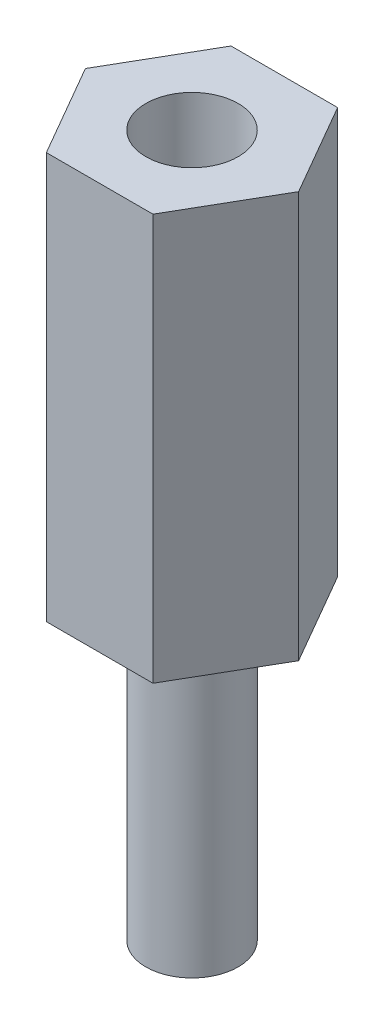
ISO-10303-21;
HEADER;
FILE_DESCRIPTION(('STEP AP214'),'2;1');
FILE_NAME('part.step','',(''),(''),'','','');
FILE_SCHEMA(('AUTOMOTIVE_DESIGN { 1 0 10303 214 1 1 1 1 }'));
ENDSEC;
DATA;
#1=APPLICATION_CONTEXT('core data for automotive mechanical design processes');
#2=APPLICATION_PROTOCOL_DEFINITION('international standard','automotive_design',2000,#1);
#3=PRODUCT_CONTEXT('',#1,'mechanical');
#4=PRODUCT('Part','Part','',(#3));
#5=PRODUCT_RELATED_PRODUCT_CATEGORY('part','',(#4));
#6=PRODUCT_DEFINITION_FORMATION('','',#4);
#7=PRODUCT_DEFINITION_CONTEXT('part definition',#1,'design');
#8=PRODUCT_DEFINITION('design','',#6,#7);
#9=PRODUCT_DEFINITION_SHAPE('','',#8);
#10=(LENGTH_UNIT() NAMED_UNIT(*) SI_UNIT(.MILLI.,.METRE.));
#11=(NAMED_UNIT(*) PLANE_ANGLE_UNIT() SI_UNIT($,.RADIAN.));
#12=(NAMED_UNIT(*) SI_UNIT($,.STERADIAN.) SOLID_ANGLE_UNIT());
#13=UNCERTAINTY_MEASURE_WITH_UNIT(LENGTH_MEASURE(1.E-05),#10,'distance_accuracy_value','');
#14=(GEOMETRIC_REPRESENTATION_CONTEXT(3) GLOBAL_UNCERTAINTY_ASSIGNED_CONTEXT((#13)) GLOBAL_UNIT_ASSIGNED_CONTEXT((#10,
#11,#12)) REPRESENTATION_CONTEXT('',''));
#15=CARTESIAN_POINT('',(0.,0.,0.));
#16=DIRECTION('',(0.,0.,1.));
#17=DIRECTION('',(1.,0.,0.));
#18=AXIS2_PLACEMENT_3D('',#15,#16,#17);
#19=CARTESIAN_POINT('',(0.,11.,0.));
#20=DIRECTION('',(0.,1.,0.));
#21=DIRECTION('',(0.,0.,1.));
#22=AXIS2_PLACEMENT_3D('',#19,#20,#21);
#23=PLANE('',#22);
#24=DIRECTION('',(-0.499999999999995,0.,0.866025403784441));
#25=VECTOR('',#24,1.);
#26=CARTESIAN_POINT('',(-1.44337567297409,11.,-2.49999999999999));
#27=LINE('',#26,#25);
#28=CARTESIAN_POINT('',(-1.44337567297409,11.,-2.49999999999999));
#29=VERTEX_POINT('',#28);
#30=CARTESIAN_POINT('',(-2.88675134594813,11.,0.));
#31=VERTEX_POINT('',#30);
#32=EDGE_CURVE('E153',#29,#31,#27,.T.);
#33=ORIENTED_EDGE('',*,*,#32,.T.);
#34=DIRECTION('',(0.500000000000001,0.,0.866025403784438));
#35=VECTOR('',#34,1.);
#36=CARTESIAN_POINT('',(-2.88675134594813,11.,0.));
#37=LINE('',#36,#35);
#38=CARTESIAN_POINT('',(-1.44337567297406,11.,2.50000000000001));
#39=VERTEX_POINT('',#38);
#40=EDGE_CURVE('E101',#31,#39,#37,.T.);
#41=ORIENTED_EDGE('',*,*,#40,.T.);
#42=DIRECTION('',(1.,0.,0.));
#43=VECTOR('',#42,1.);
#44=CARTESIAN_POINT('',(-1.44337567297406,11.,2.50000000000001));
#45=LINE('',#44,#43);
#46=CARTESIAN_POINT('',(1.44337567297408,11.,2.5));
#47=VERTEX_POINT('',#46);
#48=EDGE_CURVE('E114',#39,#47,#45,.T.);
#49=ORIENTED_EDGE('',*,*,#48,.T.);
#50=DIRECTION('',(0.499999999999995,0.,-0.866025403784441));
#51=VECTOR('',#50,1.);
#52=CARTESIAN_POINT('',(1.44337567297408,11.,2.5));
#53=LINE('',#52,#51);
#54=CARTESIAN_POINT('',(2.88675134594813,11.,0.));
#55=VERTEX_POINT('',#54);
#56=EDGE_CURVE('E108',#47,#55,#53,.T.);
#57=ORIENTED_EDGE('',*,*,#56,.T.);
#58=DIRECTION('',(-0.500000000000007,0.,-0.866025403784435));
#59=VECTOR('',#58,1.);
#60=CARTESIAN_POINT('',(2.88675134594813,11.,0.));
#61=LINE('',#60,#59);
#62=CARTESIAN_POINT('',(1.44337567297404,11.,-2.50000000000002));
#63=VERTEX_POINT('',#62);
#64=EDGE_CURVE('E112',#55,#63,#61,.T.);
#65=ORIENTED_EDGE('',*,*,#64,.T.);
#66=DIRECTION('',(-1.,0.,0.));
#67=VECTOR('',#66,1.);
#68=CARTESIAN_POINT('',(1.44337567297404,11.,-2.50000000000002));
#69=LINE('',#68,#67);
#70=EDGE_CURVE('E63',#63,#29,#69,.T.);
#71=ORIENTED_EDGE('',*,*,#70,.T.);
#72=EDGE_LOOP('',(#33,#41,#49,#57,#65,#71));
#73=FACE_BOUND('',#72,.T.);
#74=CARTESIAN_POINT('',(0.,11.,0.));
#75=DIRECTION('',(0.,1.,0.));
#76=DIRECTION('',(0.,0.,1.));
#77=AXIS2_PLACEMENT_3D('',#74,#75,#76);
#78=CIRCLE('',#77,1.25);
#79=CARTESIAN_POINT('',(0.,11.,1.25));
#80=VERTEX_POINT('',#79);
#81=EDGE_CURVE('E141',#80,#80,#78,.T.);
#82=ORIENTED_EDGE('',*,*,#81,.F.);
#83=EDGE_LOOP('',(#82));
#84=FACE_BOUND('',#83,.T.);
#85=ADVANCED_FACE('F45',(#73,#84),#23,.T.);
#86=CARTESIAN_POINT('',(0.,0.,0.));
#87=DIRECTION('',(0.,1.,0.));
#88=DIRECTION('',(0.,0.,1.));
#89=AXIS2_PLACEMENT_3D('',#86,#87,#88);
#90=PLANE('',#89);
#91=DIRECTION('',(-0.499999999999995,0.,0.866025403784441));
#92=VECTOR('',#91,1.);
#93=CARTESIAN_POINT('',(-1.44337567297409,0.,-2.49999999999999));
#94=LINE('',#93,#92);
#95=CARTESIAN_POINT('',(-1.44337567297409,0.,-2.49999999999999));
#96=VERTEX_POINT('',#95);
#97=CARTESIAN_POINT('',(-2.88675134594813,0.,0.));
#98=VERTEX_POINT('',#97);
#99=EDGE_CURVE('E136',#96,#98,#94,.T.);
#100=ORIENTED_EDGE('',*,*,#99,.F.);
#101=DIRECTION('',(-1.,0.,0.));
#102=VECTOR('',#101,1.);
#103=CARTESIAN_POINT('',(1.44337567297404,0.,-2.50000000000002));
#104=LINE('',#103,#102);
#105=CARTESIAN_POINT('',(1.44337567297404,0.,-2.50000000000002));
#106=VERTEX_POINT('',#105);
#107=EDGE_CURVE('E92',#106,#96,#104,.T.);
#108=ORIENTED_EDGE('',*,*,#107,.F.);
#109=DIRECTION('',(-0.500000000000007,0.,-0.866025403784435));
#110=VECTOR('',#109,1.);
#111=CARTESIAN_POINT('',(2.88675134594813,0.,0.));
#112=LINE('',#111,#110);
#113=CARTESIAN_POINT('',(2.88675134594813,0.,0.));
#114=VERTEX_POINT('',#113);
#115=EDGE_CURVE('E86',#114,#106,#112,.T.);
#116=ORIENTED_EDGE('',*,*,#115,.F.);
#117=DIRECTION('',(0.499999999999995,0.,-0.866025403784441));
#118=VECTOR('',#117,1.);
#119=CARTESIAN_POINT('',(1.44337567297408,0.,2.5));
#120=LINE('',#119,#118);
#121=CARTESIAN_POINT('',(1.44337567297408,0.,2.5));
#122=VERTEX_POINT('',#121);
#123=EDGE_CURVE('E123',#122,#114,#120,.T.);
#124=ORIENTED_EDGE('',*,*,#123,.F.);
#125=DIRECTION('',(1.,0.,0.));
#126=VECTOR('',#125,1.);
#127=CARTESIAN_POINT('',(-1.44337567297406,0.,2.50000000000001));
#128=LINE('',#127,#126);
#129=CARTESIAN_POINT('',(-1.44337567297406,0.,2.50000000000001));
#130=VERTEX_POINT('',#129);
#131=EDGE_CURVE('E144',#130,#122,#128,.T.);
#132=ORIENTED_EDGE('',*,*,#131,.F.);
#133=DIRECTION('',(0.500000000000001,0.,0.866025403784438));
#134=VECTOR('',#133,1.);
#135=CARTESIAN_POINT('',(-2.88675134594813,0.,0.));
#136=LINE('',#135,#134);
#137=EDGE_CURVE('E140',#98,#130,#136,.T.);
#138=ORIENTED_EDGE('',*,*,#137,.F.);
#139=EDGE_LOOP('',(#100,#108,#116,#124,#132,#138));
#140=FACE_BOUND('',#139,.T.);
#141=CARTESIAN_POINT('',(0.,0.,0.));
#142=DIRECTION('',(0.,1.,0.));
#143=DIRECTION('',(0.,0.,1.));
#144=AXIS2_PLACEMENT_3D('',#141,#142,#143);
#145=CIRCLE('',#144,1.25);
#146=CARTESIAN_POINT('',(0.,0.,1.25));
#147=VERTEX_POINT('',#146);
#148=EDGE_CURVE('E184',#147,#147,#145,.F.);
#149=ORIENTED_EDGE('',*,*,#148,.F.);
#150=EDGE_LOOP('',(#149));
#151=FACE_BOUND('',#150,.T.);
#152=ADVANCED_FACE('F170',(#140,#151),#90,.F.);
#153=CARTESIAN_POINT('',(-1.44337567297409,11.,-2.49999999999999));
#154=DIRECTION('',(0.866025403784441,0.,0.499999999999995));
#155=DIRECTION('',(0.499999999999995,0.,-0.866025403784441));
#156=AXIS2_PLACEMENT_3D('',#153,#154,#155);
#157=PLANE('',#156);
#158=ORIENTED_EDGE('',*,*,#99,.T.);
#159=DIRECTION('',(0.,-1.,0.));
#160=VECTOR('',#159,1.);
#161=CARTESIAN_POINT('',(-2.88675134594813,11.,0.));
#162=LINE('',#161,#160);
#163=EDGE_CURVE('E55',#31,#98,#162,.T.);
#164=ORIENTED_EDGE('',*,*,#163,.F.);
#165=ORIENTED_EDGE('',*,*,#32,.F.);
#166=DIRECTION('',(0.,-1.,0.));
#167=VECTOR('',#166,1.);
#168=CARTESIAN_POINT('',(-1.44337567297409,11.,-2.49999999999999));
#169=LINE('',#168,#167);
#170=EDGE_CURVE('E132',#29,#96,#169,.T.);
#171=ORIENTED_EDGE('',*,*,#170,.T.);
#172=EDGE_LOOP('',(#158,#164,#165,#171));
#173=FACE_BOUND('',#172,.T.);
#174=ADVANCED_FACE('F47',(#173),#157,.F.);
#175=CARTESIAN_POINT('',(-2.88675134594813,11.,0.));
#176=DIRECTION('',(0.866025403784438,0.,-0.500000000000001));
#177=DIRECTION('',(-0.500000000000001,0.,-0.866025403784438));
#178=AXIS2_PLACEMENT_3D('',#175,#176,#177);
#179=PLANE('',#178);
#180=ORIENTED_EDGE('',*,*,#137,.T.);
#181=DIRECTION('',(0.,-1.,0.));
#182=VECTOR('',#181,1.);
#183=CARTESIAN_POINT('',(-1.44337567297406,11.,2.50000000000001));
#184=LINE('',#183,#182);
#185=EDGE_CURVE('E160',#39,#130,#184,.T.);
#186=ORIENTED_EDGE('',*,*,#185,.F.);
#187=ORIENTED_EDGE('',*,*,#40,.F.);
#188=ORIENTED_EDGE('',*,*,#163,.T.);
#189=EDGE_LOOP('',(#180,#186,#187,#188));
#190=FACE_BOUND('',#189,.T.);
#191=ADVANCED_FACE('F165',(#190),#179,.F.);
#192=CARTESIAN_POINT('',(-1.44337567297406,11.,2.50000000000001));
#193=DIRECTION('',(0.,0.,-1.));
#194=DIRECTION('',(-1.,0.,0.));
#195=AXIS2_PLACEMENT_3D('',#192,#193,#194);
#196=PLANE('',#195);
#197=ORIENTED_EDGE('',*,*,#131,.T.);
#198=DIRECTION('',(0.,-1.,0.));
#199=VECTOR('',#198,1.);
#200=CARTESIAN_POINT('',(1.44337567297408,11.,2.5));
#201=LINE('',#200,#199);
#202=EDGE_CURVE('E125',#47,#122,#201,.T.);
#203=ORIENTED_EDGE('',*,*,#202,.F.);
#204=ORIENTED_EDGE('',*,*,#48,.F.);
#205=ORIENTED_EDGE('',*,*,#185,.T.);
#206=EDGE_LOOP('',(#197,#203,#204,#205));
#207=FACE_BOUND('',#206,.T.);
#208=ADVANCED_FACE('F174',(#207),#196,.F.);
#209=CARTESIAN_POINT('',(1.44337567297408,11.,2.5));
#210=DIRECTION('',(-0.866025403784441,0.,-0.499999999999995));
#211=DIRECTION('',(-0.499999999999995,0.,0.866025403784441));
#212=AXIS2_PLACEMENT_3D('',#209,#210,#211);
#213=PLANE('',#212);
#214=ORIENTED_EDGE('',*,*,#123,.T.);
#215=DIRECTION('',(0.,-1.,0.));
#216=VECTOR('',#215,1.);
#217=CARTESIAN_POINT('',(2.88675134594813,11.,0.));
#218=LINE('',#217,#216);
#219=EDGE_CURVE('E120',#55,#114,#218,.T.);
#220=ORIENTED_EDGE('',*,*,#219,.F.);
#221=ORIENTED_EDGE('',*,*,#56,.F.);
#222=ORIENTED_EDGE('',*,*,#202,.T.);
#223=EDGE_LOOP('',(#214,#220,#221,#222));
#224=FACE_BOUND('',#223,.T.);
#225=ADVANCED_FACE('F121',(#224),#213,.F.);
#226=CARTESIAN_POINT('',(2.88675134594813,11.,0.));
#227=DIRECTION('',(-0.866025403784435,0.,0.500000000000007));
#228=DIRECTION('',(0.500000000000007,0.,0.866025403784434));
#229=AXIS2_PLACEMENT_3D('',#226,#227,#228);
#230=PLANE('',#229);
#231=ORIENTED_EDGE('',*,*,#115,.T.);
#232=DIRECTION('',(0.,-1.,0.));
#233=VECTOR('',#232,1.);
#234=CARTESIAN_POINT('',(1.44337567297404,11.,-2.50000000000002));
#235=LINE('',#234,#233);
#236=EDGE_CURVE('E126',#63,#106,#235,.T.);
#237=ORIENTED_EDGE('',*,*,#236,.F.);
#238=ORIENTED_EDGE('',*,*,#64,.F.);
#239=ORIENTED_EDGE('',*,*,#219,.T.);
#240=EDGE_LOOP('',(#231,#237,#238,#239));
#241=FACE_BOUND('',#240,.T.);
#242=ADVANCED_FACE('F128',(#241),#230,.F.);
#243=CARTESIAN_POINT('',(1.44337567297404,11.,-2.50000000000002));
#244=DIRECTION('',(0.,0.,1.));
#245=DIRECTION('',(1.,0.,0.));
#246=AXIS2_PLACEMENT_3D('',#243,#244,#245);
#247=PLANE('',#246);
#248=ORIENTED_EDGE('',*,*,#107,.T.);
#249=ORIENTED_EDGE('',*,*,#170,.F.);
#250=ORIENTED_EDGE('',*,*,#70,.F.);
#251=ORIENTED_EDGE('',*,*,#236,.T.);
#252=EDGE_LOOP('',(#248,#249,#250,#251));
#253=FACE_BOUND('',#252,.T.);
#254=ADVANCED_FACE('F214',(#253),#247,.F.);
#255=CARTESIAN_POINT('',(0.,11.,0.));
#256=DIRECTION('',(0.,-1.,0.));
#257=DIRECTION('',(0.,0.,-1.));
#258=AXIS2_PLACEMENT_3D('',#255,#256,#257);
#259=CYLINDRICAL_SURFACE('',#258,1.25);
#260=CARTESIAN_POINT('',(0.,2.,0.));
#261=DIRECTION('',(0.,1.,0.));
#262=DIRECTION('',(0.,0.,1.));
#263=AXIS2_PLACEMENT_3D('',#260,#261,#262);
#264=CIRCLE('',#263,1.25);
#265=CARTESIAN_POINT('',(0.,2.,1.25));
#266=VERTEX_POINT('',#265);
#267=EDGE_CURVE('E11',#266,#266,#264,.T.);
#268=ORIENTED_EDGE('',*,*,#267,.F.);
#269=EDGE_LOOP('',(#268));
#270=FACE_BOUND('',#269,.T.);
#271=ORIENTED_EDGE('',*,*,#81,.T.);
#272=EDGE_LOOP('',(#271));
#273=FACE_BOUND('',#272,.T.);
#274=ADVANCED_FACE('F212',(#270,#273),#259,.F.);
#275=CARTESIAN_POINT('',(0.,2.,0.));
#276=DIRECTION('',(0.,1.,0.));
#277=DIRECTION('',(0.,0.,1.));
#278=AXIS2_PLACEMENT_3D('',#275,#276,#277);
#279=PLANE('',#278);
#280=ORIENTED_EDGE('',*,*,#267,.T.);
#281=EDGE_LOOP('',(#280));
#282=FACE_BOUND('',#281,.T.);
#283=ADVANCED_FACE('F202',(#282),#279,.T.);
#284=CARTESIAN_POINT('',(0.,2.,0.));
#285=DIRECTION('',(0.,-1.,0.));
#286=DIRECTION('',(0.,0.,-1.));
#287=AXIS2_PLACEMENT_3D('',#284,#285,#286);
#288=CYLINDRICAL_SURFACE('',#287,1.25);
#289=CARTESIAN_POINT('',(0.,-8.,0.));
#290=DIRECTION('',(0.,1.,0.));
#291=DIRECTION('',(0.,0.,1.));
#292=AXIS2_PLACEMENT_3D('',#289,#290,#291);
#293=CIRCLE('',#292,1.25);
#294=CARTESIAN_POINT('',(0.,-8.,1.25));
#295=VERTEX_POINT('',#294);
#296=EDGE_CURVE('E188',#295,#295,#293,.T.);
#297=ORIENTED_EDGE('',*,*,#296,.T.);
#298=EDGE_LOOP('',(#297));
#299=FACE_BOUND('',#298,.T.);
#300=ORIENTED_EDGE('',*,*,#148,.T.);
#301=EDGE_LOOP('',(#300));
#302=FACE_BOUND('',#301,.T.);
#303=ADVANCED_FACE('F193',(#299,#302),#288,.T.);
#304=CARTESIAN_POINT('',(0.,-8.,0.));
#305=DIRECTION('',(0.,1.,0.));
#306=DIRECTION('',(0.,0.,1.));
#307=AXIS2_PLACEMENT_3D('',#304,#305,#306);
#308=PLANE('',#307);
#309=ORIENTED_EDGE('',*,*,#296,.F.);
#310=EDGE_LOOP('',(#309));
#311=FACE_BOUND('',#310,.T.);
#312=ADVANCED_FACE('F196',(#311),#308,.F.);
#313=CLOSED_SHELL('',(#85,#152,#174,#191,#208,#225,#242,#254,#274,#283,#303,#312));
#314=MANIFOLD_SOLID_BREP('B2',#313);
#315=ADVANCED_BREP_SHAPE_REPRESENTATION('',(#18,#314),#14);
#316=SHAPE_DEFINITION_REPRESENTATION(#9,#315);
ENDSEC;
END-ISO-10303-21;
